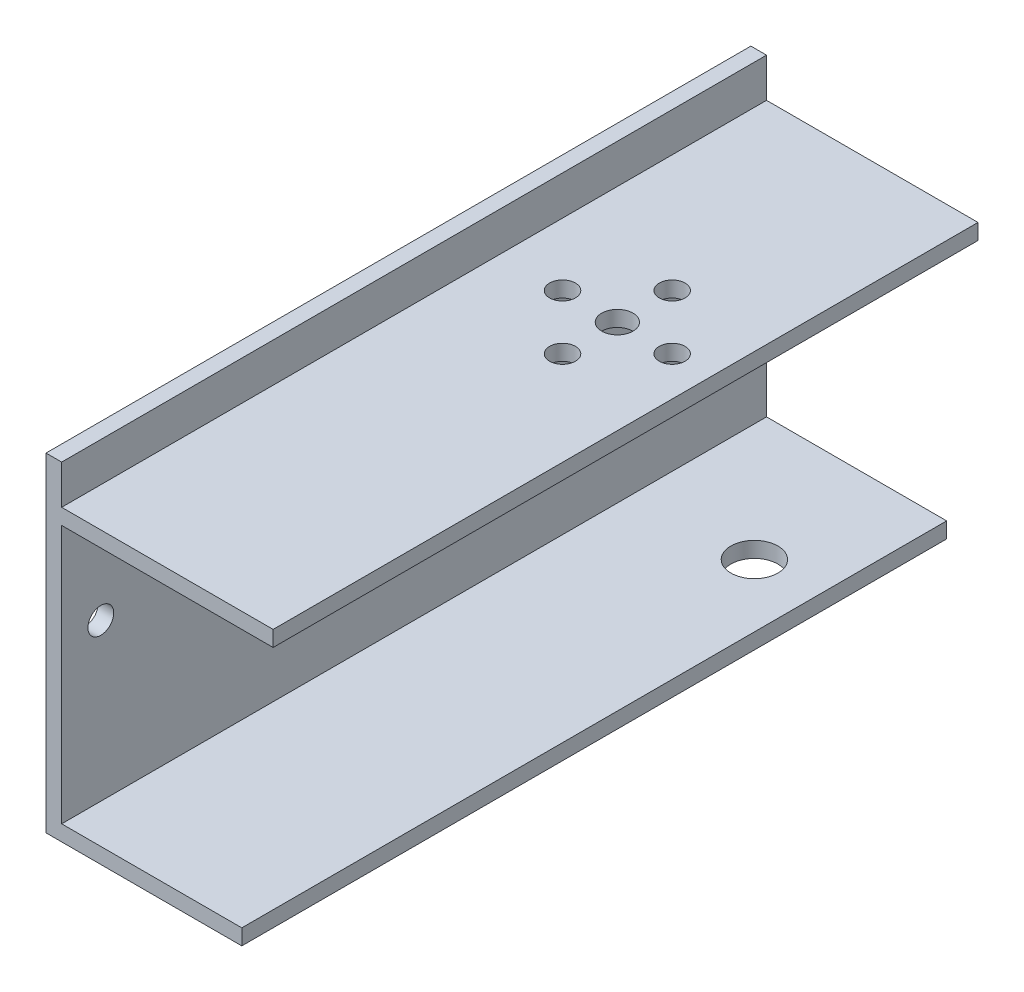
ISO-10303-21;
HEADER;
FILE_DESCRIPTION(('STEP AP214'),'2;1');
FILE_NAME('part.step','',(''),(''),'','','');
FILE_SCHEMA(('AUTOMOTIVE_DESIGN { 1 0 10303 214 1 1 1 1 }'));
ENDSEC;
DATA;
#1=APPLICATION_CONTEXT('core data for automotive mechanical design processes');
#2=APPLICATION_PROTOCOL_DEFINITION('international standard','automotive_design',2000,#1);
#3=PRODUCT_CONTEXT('',#1,'mechanical');
#4=PRODUCT('Part','Part','',(#3));
#5=PRODUCT_RELATED_PRODUCT_CATEGORY('part','',(#4));
#6=PRODUCT_DEFINITION_FORMATION('','',#4);
#7=PRODUCT_DEFINITION_CONTEXT('part definition',#1,'design');
#8=PRODUCT_DEFINITION('design','',#6,#7);
#9=PRODUCT_DEFINITION_SHAPE('','',#8);
#10=(LENGTH_UNIT() NAMED_UNIT(*) SI_UNIT(.MILLI.,.METRE.));
#11=(NAMED_UNIT(*) PLANE_ANGLE_UNIT() SI_UNIT($,.RADIAN.));
#12=(NAMED_UNIT(*) SI_UNIT($,.STERADIAN.) SOLID_ANGLE_UNIT());
#13=UNCERTAINTY_MEASURE_WITH_UNIT(LENGTH_MEASURE(1.E-05),#10,'distance_accuracy_value','');
#14=(GEOMETRIC_REPRESENTATION_CONTEXT(3) GLOBAL_UNCERTAINTY_ASSIGNED_CONTEXT((#13)) GLOBAL_UNIT_ASSIGNED_CONTEXT((#10,
#11,#12)) REPRESENTATION_CONTEXT('',''));
#15=CARTESIAN_POINT('',(0.,0.,0.));
#16=DIRECTION('',(0.,0.,1.));
#17=DIRECTION('',(1.,0.,0.));
#18=AXIS2_PLACEMENT_3D('',#15,#16,#17);
#19=CARTESIAN_POINT('',(-10.5,42.,-45.));
#20=DIRECTION('',(-1.,0.,0.));
#21=DIRECTION('',(0.,0.,1.));
#22=AXIS2_PLACEMENT_3D('',#19,#20,#21);
#23=PLANE('',#22);
#24=CARTESIAN_POINT('',(-10.5,28.,15.));
#25=DIRECTION('',(-1.,0.,0.));
#26=DIRECTION('',(0.,0.,1.));
#27=AXIS2_PLACEMENT_3D('',#24,#25,#26);
#28=CIRCLE('',#27,1.65);
#29=CARTESIAN_POINT('',(-10.5,28.,16.65));
#30=VERTEX_POINT('',#29);
#31=EDGE_CURVE('E175',#30,#30,#28,.T.);
#32=ORIENTED_EDGE('',*,*,#31,.T.);
#33=EDGE_LOOP('',(#32));
#34=FACE_BOUND('',#33,.T.);
#35=CARTESIAN_POINT('',(-10.5,14.,15.));
#36=DIRECTION('',(-1.,0.,0.));
#37=DIRECTION('',(0.,0.,1.));
#38=AXIS2_PLACEMENT_3D('',#35,#36,#37);
#39=CIRCLE('',#38,1.65);
#40=CARTESIAN_POINT('',(-10.5,14.,16.65));
#41=VERTEX_POINT('',#40);
#42=EDGE_CURVE('E229',#41,#41,#39,.T.);
#43=ORIENTED_EDGE('',*,*,#42,.T.);
#44=EDGE_LOOP('',(#43));
#45=FACE_BOUND('',#44,.T.);
#46=CARTESIAN_POINT('',(-10.5,17.3833849643897,21.5247955875199));
#47=DIRECTION('',(-1.,0.,0.));
#48=DIRECTION('',(0.,0.,1.));
#49=AXIS2_PLACEMENT_3D('',#46,#47,#48);
#50=CIRCLE('',#49,1.65);
#51=CARTESIAN_POINT('',(-10.5,17.3833849643897,23.1747955875199));
#52=VERTEX_POINT('',#51);
#53=EDGE_CURVE('E232',#52,#52,#50,.T.);
#54=ORIENTED_EDGE('',*,*,#53,.T.);
#55=EDGE_LOOP('',(#54));
#56=FACE_BOUND('',#55,.T.);
#57=CARTESIAN_POINT('',(-10.5,21.,8.00000000000001));
#58=DIRECTION('',(-1.,0.,0.));
#59=DIRECTION('',(0.,0.,1.));
#60=AXIS2_PLACEMENT_3D('',#57,#58,#59);
#61=CIRCLE('',#60,1.65);
#62=CARTESIAN_POINT('',(-10.5,21.,9.65000000000001));
#63=VERTEX_POINT('',#62);
#64=EDGE_CURVE('E196',#63,#63,#61,.T.);
#65=ORIENTED_EDGE('',*,*,#64,.T.);
#66=EDGE_LOOP('',(#65));
#67=FACE_BOUND('',#66,.T.);
#68=CARTESIAN_POINT('',(-10.5,22.,-40.));
#69=DIRECTION('',(1.,0.,0.));
#70=DIRECTION('',(0.,0.,-1.));
#71=AXIS2_PLACEMENT_3D('',#68,#69,#70);
#72=CIRCLE('',#71,1.65);
#73=CARTESIAN_POINT('',(-10.5,22.,-41.65));
#74=VERTEX_POINT('',#73);
#75=EDGE_CURVE('E148',#74,#74,#72,.T.);
#76=ORIENTED_EDGE('',*,*,#75,.F.);
#77=EDGE_LOOP('',(#76));
#78=FACE_BOUND('',#77,.T.);
#79=CARTESIAN_POINT('',(-10.5,22.,40.));
#80=DIRECTION('',(1.,0.,0.));
#81=DIRECTION('',(0.,0.,-1.));
#82=AXIS2_PLACEMENT_3D('',#79,#80,#81);
#83=CIRCLE('',#82,1.65);
#84=CARTESIAN_POINT('',(-10.5,22.,38.35));
#85=VERTEX_POINT('',#84);
#86=EDGE_CURVE('E151',#85,#85,#83,.T.);
#87=ORIENTED_EDGE('',*,*,#86,.F.);
#88=EDGE_LOOP('',(#87));
#89=FACE_BOUND('',#88,.T.);
#90=DIRECTION('',(0.,0.,-1.));
#91=VECTOR('',#90,1.);
#92=CARTESIAN_POINT('',(-10.5,35.,0.));
#93=LINE('',#92,#91);
#94=CARTESIAN_POINT('',(-10.5,35.,45.));
#95=VERTEX_POINT('',#94);
#96=CARTESIAN_POINT('',(-10.5,35.,-45.));
#97=VERTEX_POINT('',#96);
#98=EDGE_CURVE('E64',#95,#97,#93,.T.);
#99=ORIENTED_EDGE('',*,*,#98,.F.);
#100=DIRECTION('',(0.,-1.,0.));
#101=VECTOR('',#100,1.);
#102=CARTESIAN_POINT('',(-10.5,42.,45.));
#103=LINE('',#102,#101);
#104=CARTESIAN_POINT('',(-10.5,2.,45.));
#105=VERTEX_POINT('',#104);
#106=EDGE_CURVE('E147',#95,#105,#103,.T.);
#107=ORIENTED_EDGE('',*,*,#106,.T.);
#108=DIRECTION('',(0.,0.,-1.));
#109=VECTOR('',#108,1.);
#110=CARTESIAN_POINT('',(-10.5,2.,-45.));
#111=LINE('',#110,#109);
#112=CARTESIAN_POINT('',(-10.5,2.,-45.));
#113=VERTEX_POINT('',#112);
#114=EDGE_CURVE('E188',#105,#113,#111,.T.);
#115=ORIENTED_EDGE('',*,*,#114,.T.);
#116=DIRECTION('',(0.,-1.,0.));
#117=VECTOR('',#116,1.);
#118=CARTESIAN_POINT('',(-10.5,42.,-45.));
#119=LINE('',#118,#117);
#120=EDGE_CURVE('E69',#97,#113,#119,.T.);
#121=ORIENTED_EDGE('',*,*,#120,.F.);
#122=EDGE_LOOP('',(#99,#107,#115,#121));
#123=FACE_BOUND('',#122,.T.);
#124=ADVANCED_FACE('F47',(#34,#45,#56,#67,#78,#89,#123),#23,.F.);
#125=DIRECTION('',(0.,0.,1.));
#126=VECTOR('',#125,1.);
#127=CARTESIAN_POINT('',(-10.5,37.,0.));
#128=LINE('',#127,#126);
#129=CARTESIAN_POINT('',(-10.5,37.,-45.));
#130=VERTEX_POINT('',#129);
#131=CARTESIAN_POINT('',(-10.5,37.,45.));
#132=VERTEX_POINT('',#131);
#133=EDGE_CURVE('E143',#130,#132,#128,.T.);
#134=ORIENTED_EDGE('',*,*,#133,.F.);
#135=CARTESIAN_POINT('',(-10.5,42.,-45.));
#136=VERTEX_POINT('',#135);
#137=EDGE_CURVE('E197',#136,#130,#119,.T.);
#138=ORIENTED_EDGE('',*,*,#137,.F.);
#139=DIRECTION('',(0.,0.,-1.));
#140=VECTOR('',#139,1.);
#141=CARTESIAN_POINT('',(-10.5,42.,-45.));
#142=LINE('',#141,#140);
#143=CARTESIAN_POINT('',(-10.5,42.,45.));
#144=VERTEX_POINT('',#143);
#145=EDGE_CURVE('E190',#144,#136,#142,.T.);
#146=ORIENTED_EDGE('',*,*,#145,.F.);
#147=EDGE_CURVE('E200',#144,#132,#103,.T.);
#148=ORIENTED_EDGE('',*,*,#147,.T.);
#149=EDGE_LOOP('',(#134,#138,#146,#148));
#150=FACE_BOUND('',#149,.T.);
#151=ADVANCED_FACE('F270',(#150),#23,.F.);
#152=CARTESIAN_POINT('',(0.,2.,0.));
#153=DIRECTION('',(0.,-1.,0.));
#154=DIRECTION('',(0.,0.,-1.));
#155=AXIS2_PLACEMENT_3D('',#152,#153,#154);
#156=PLANE('',#155);
#157=CARTESIAN_POINT('',(4.5,2.,-28.45));
#158=DIRECTION('',(0.,-1.,0.));
#159=DIRECTION('',(0.,0.,-1.));
#160=AXIS2_PLACEMENT_3D('',#157,#158,#159);
#161=CIRCLE('',#160,3.);
#162=CARTESIAN_POINT('',(4.5,2.,-31.45));
#163=VERTEX_POINT('',#162);
#164=EDGE_CURVE('E168',#163,#163,#161,.T.);
#165=ORIENTED_EDGE('',*,*,#164,.T.);
#166=EDGE_LOOP('',(#165));
#167=FACE_BOUND('',#166,.T.);
#168=ORIENTED_EDGE('',*,*,#114,.F.);
#169=DIRECTION('',(1.,0.,0.));
#170=VECTOR('',#169,1.);
#171=CARTESIAN_POINT('',(-12.5,2.,45.));
#172=LINE('',#171,#170);
#173=CARTESIAN_POINT('',(12.5,2.,45.));
#174=VERTEX_POINT('',#173);
#175=EDGE_CURVE('E210',#105,#174,#172,.T.);
#176=ORIENTED_EDGE('',*,*,#175,.T.);
#177=DIRECTION('',(0.,0.,-1.));
#178=VECTOR('',#177,1.);
#179=CARTESIAN_POINT('',(12.5,2.,45.));
#180=LINE('',#179,#178);
#181=CARTESIAN_POINT('',(12.5,2.,-45.));
#182=VERTEX_POINT('',#181);
#183=EDGE_CURVE('E203',#174,#182,#180,.T.);
#184=ORIENTED_EDGE('',*,*,#183,.T.);
#185=DIRECTION('',(-1.,0.,0.));
#186=VECTOR('',#185,1.);
#187=CARTESIAN_POINT('',(-12.5,2.,-45.));
#188=LINE('',#187,#186);
#189=EDGE_CURVE('E206',#182,#113,#188,.T.);
#190=ORIENTED_EDGE('',*,*,#189,.T.);
#191=EDGE_LOOP('',(#168,#176,#184,#190));
#192=FACE_BOUND('',#191,.T.);
#193=ADVANCED_FACE('F289',(#167,#192),#156,.F.);
#194=CARTESIAN_POINT('',(12.5,2.,45.));
#195=DIRECTION('',(-1.,0.,0.));
#196=DIRECTION('',(0.,0.,1.));
#197=AXIS2_PLACEMENT_3D('',#194,#195,#196);
#198=PLANE('',#197);
#199=DIRECTION('',(0.,0.,-1.));
#200=VECTOR('',#199,1.);
#201=CARTESIAN_POINT('',(12.5,0.,45.));
#202=LINE('',#201,#200);
#203=CARTESIAN_POINT('',(12.5,0.,45.));
#204=VERTEX_POINT('',#203);
#205=CARTESIAN_POINT('',(12.5,0.,-45.));
#206=VERTEX_POINT('',#205);
#207=EDGE_CURVE('E202',#204,#206,#202,.T.);
#208=ORIENTED_EDGE('',*,*,#207,.T.);
#209=DIRECTION('',(0.,-1.,0.));
#210=VECTOR('',#209,1.);
#211=CARTESIAN_POINT('',(12.5,2.,-45.));
#212=LINE('',#211,#210);
#213=EDGE_CURVE('E12',#182,#206,#212,.T.);
#214=ORIENTED_EDGE('',*,*,#213,.F.);
#215=ORIENTED_EDGE('',*,*,#183,.F.);
#216=DIRECTION('',(0.,-1.,0.));
#217=VECTOR('',#216,1.);
#218=CARTESIAN_POINT('',(12.5,2.,45.));
#219=LINE('',#218,#217);
#220=EDGE_CURVE('E212',#174,#204,#219,.T.);
#221=ORIENTED_EDGE('',*,*,#220,.T.);
#222=EDGE_LOOP('',(#208,#214,#215,#221));
#223=FACE_BOUND('',#222,.T.);
#224=ADVANCED_FACE('F49',(#223),#198,.F.);
#225=CARTESIAN_POINT('',(-12.5,2.,-45.));
#226=DIRECTION('',(0.,0.,1.));
#227=DIRECTION('',(1.,0.,0.));
#228=AXIS2_PLACEMENT_3D('',#225,#226,#227);
#229=PLANE('',#228);
#230=DIRECTION('',(-1.,0.,0.));
#231=VECTOR('',#230,1.);
#232=CARTESIAN_POINT('',(-12.5,0.,-45.));
#233=LINE('',#232,#231);
#234=CARTESIAN_POINT('',(-12.5,0.,-45.));
#235=VERTEX_POINT('',#234);
#236=EDGE_CURVE('E215',#206,#235,#233,.T.);
#237=ORIENTED_EDGE('',*,*,#236,.T.);
#238=DIRECTION('',(0.,-1.,0.));
#239=VECTOR('',#238,1.);
#240=CARTESIAN_POINT('',(-12.5,2.,-45.));
#241=LINE('',#240,#239);
#242=CARTESIAN_POINT('',(-12.5,42.,-45.));
#243=VERTEX_POINT('',#242);
#244=EDGE_CURVE('E56',#243,#235,#241,.T.);
#245=ORIENTED_EDGE('',*,*,#244,.F.);
#246=DIRECTION('',(-1.,0.,0.));
#247=VECTOR('',#246,1.);
#248=CARTESIAN_POINT('',(-12.5,42.,-45.));
#249=LINE('',#248,#247);
#250=EDGE_CURVE('E192',#136,#243,#249,.T.);
#251=ORIENTED_EDGE('',*,*,#250,.F.);
#252=ORIENTED_EDGE('',*,*,#137,.T.);
#253=DIRECTION('',(-1.,0.,0.));
#254=VECTOR('',#253,1.);
#255=CARTESIAN_POINT('',(16.5,37.,-45.));
#256=LINE('',#255,#254);
#257=CARTESIAN_POINT('',(16.5,37.,-45.));
#258=VERTEX_POINT('',#257);
#259=EDGE_CURVE('E153',#258,#130,#256,.T.);
#260=ORIENTED_EDGE('',*,*,#259,.F.);
#261=DIRECTION('',(0.,1.,0.));
#262=VECTOR('',#261,1.);
#263=CARTESIAN_POINT('',(16.5,0.,-45.));
#264=LINE('',#263,#262);
#265=CARTESIAN_POINT('',(16.5,35.,-45.));
#266=VERTEX_POINT('',#265);
#267=EDGE_CURVE('E133',#266,#258,#264,.T.);
#268=ORIENTED_EDGE('',*,*,#267,.F.);
#269=DIRECTION('',(-1.,0.,0.));
#270=VECTOR('',#269,1.);
#271=CARTESIAN_POINT('',(16.5,35.,-45.));
#272=LINE('',#271,#270);
#273=EDGE_CURVE('E130',#266,#97,#272,.T.);
#274=ORIENTED_EDGE('',*,*,#273,.T.);
#275=ORIENTED_EDGE('',*,*,#120,.T.);
#276=ORIENTED_EDGE('',*,*,#189,.F.);
#277=ORIENTED_EDGE('',*,*,#213,.T.);
#278=EDGE_LOOP('',(#237,#245,#251,#252,#260,#268,#274,#275,#276,#277));
#279=FACE_BOUND('',#278,.T.);
#280=ADVANCED_FACE('F265',(#279),#229,.F.);
#281=CARTESIAN_POINT('',(-12.5,2.,45.));
#282=DIRECTION('',(1.,0.,0.));
#283=DIRECTION('',(0.,0.,-1.));
#284=AXIS2_PLACEMENT_3D('',#281,#282,#283);
#285=PLANE('',#284);
#286=CARTESIAN_POINT('',(-12.5,22.,40.));
#287=DIRECTION('',(1.,0.,0.));
#288=DIRECTION('',(0.,0.,-1.));
#289=AXIS2_PLACEMENT_3D('',#286,#287,#288);
#290=CIRCLE('',#289,1.65);
#291=CARTESIAN_POINT('',(-12.5,22.,38.35));
#292=VERTEX_POINT('',#291);
#293=EDGE_CURVE('E162',#292,#292,#290,.T.);
#294=ORIENTED_EDGE('',*,*,#293,.T.);
#295=EDGE_LOOP('',(#294));
#296=FACE_BOUND('',#295,.T.);
#297=CARTESIAN_POINT('',(-12.5,22.,-40.));
#298=DIRECTION('',(1.,0.,0.));
#299=DIRECTION('',(0.,0.,-1.));
#300=AXIS2_PLACEMENT_3D('',#297,#298,#299);
#301=CIRCLE('',#300,1.65);
#302=CARTESIAN_POINT('',(-12.5,22.,-41.65));
#303=VERTEX_POINT('',#302);
#304=EDGE_CURVE('E158',#303,#303,#301,.T.);
#305=ORIENTED_EDGE('',*,*,#304,.T.);
#306=EDGE_LOOP('',(#305));
#307=FACE_BOUND('',#306,.T.);
#308=CARTESIAN_POINT('',(-12.5,21.,8.00000000000001));
#309=DIRECTION('',(-1.,0.,0.));
#310=DIRECTION('',(0.,0.,1.));
#311=AXIS2_PLACEMENT_3D('',#308,#309,#310);
#312=CIRCLE('',#311,1.65);
#313=CARTESIAN_POINT('',(-12.5,21.,9.65000000000001));
#314=VERTEX_POINT('',#313);
#315=EDGE_CURVE('E172',#314,#314,#312,.T.);
#316=ORIENTED_EDGE('',*,*,#315,.F.);
#317=EDGE_LOOP('',(#316));
#318=FACE_BOUND('',#317,.T.);
#319=CARTESIAN_POINT('',(-12.5,17.3833849643897,21.5247955875199));
#320=DIRECTION('',(-1.,0.,0.));
#321=DIRECTION('',(0.,0.,-1.));
#322=AXIS2_PLACEMENT_3D('',#319,#320,#321);
#323=CIRCLE('',#322,1.65);
#324=CARTESIAN_POINT('',(-12.5,17.3833849643897,19.8747955875199));
#325=VERTEX_POINT('',#324);
#326=EDGE_CURVE('E176',#325,#325,#323,.T.);
#327=ORIENTED_EDGE('',*,*,#326,.F.);
#328=EDGE_LOOP('',(#327));
#329=FACE_BOUND('',#328,.T.);
#330=CARTESIAN_POINT('',(-12.5,14.,15.));
#331=DIRECTION('',(-1.,0.,0.));
#332=DIRECTION('',(0.,0.,1.));
#333=AXIS2_PLACEMENT_3D('',#330,#331,#332);
#334=CIRCLE('',#333,1.65);
#335=CARTESIAN_POINT('',(-12.5,14.,16.65));
#336=VERTEX_POINT('',#335);
#337=EDGE_CURVE('E179',#336,#336,#334,.T.);
#338=ORIENTED_EDGE('',*,*,#337,.F.);
#339=EDGE_LOOP('',(#338));
#340=FACE_BOUND('',#339,.T.);
#341=CARTESIAN_POINT('',(-12.5,28.,15.));
#342=DIRECTION('',(-1.,0.,0.));
#343=DIRECTION('',(0.,0.,-1.));
#344=AXIS2_PLACEMENT_3D('',#341,#342,#343);
#345=CIRCLE('',#344,1.65);
#346=CARTESIAN_POINT('',(-12.5,28.,13.35));
#347=VERTEX_POINT('',#346);
#348=EDGE_CURVE('E171',#347,#347,#345,.T.);
#349=ORIENTED_EDGE('',*,*,#348,.F.);
#350=EDGE_LOOP('',(#349));
#351=FACE_BOUND('',#350,.T.);
#352=DIRECTION('',(0.,0.,1.));
#353=VECTOR('',#352,1.);
#354=CARTESIAN_POINT('',(-12.5,0.,45.));
#355=LINE('',#354,#353);
#356=CARTESIAN_POINT('',(-12.5,0.,45.));
#357=VERTEX_POINT('',#356);
#358=EDGE_CURVE('E217',#235,#357,#355,.T.);
#359=ORIENTED_EDGE('',*,*,#358,.T.);
#360=DIRECTION('',(0.,-1.,0.));
#361=VECTOR('',#360,1.);
#362=CARTESIAN_POINT('',(-12.5,2.,45.));
#363=LINE('',#362,#361);
#364=CARTESIAN_POINT('',(-12.5,42.,45.));
#365=VERTEX_POINT('',#364);
#366=EDGE_CURVE('E222',#365,#357,#363,.T.);
#367=ORIENTED_EDGE('',*,*,#366,.F.);
#368=DIRECTION('',(0.,0.,1.));
#369=VECTOR('',#368,1.);
#370=CARTESIAN_POINT('',(-12.5,42.,-45.));
#371=LINE('',#370,#369);
#372=EDGE_CURVE('E184',#243,#365,#371,.T.);
#373=ORIENTED_EDGE('',*,*,#372,.F.);
#374=ORIENTED_EDGE('',*,*,#244,.T.);
#375=EDGE_LOOP('',(#359,#367,#373,#374));
#376=FACE_BOUND('',#375,.T.);
#377=ADVANCED_FACE('F278',(#296,#307,#318,#329,#340,#351,#376),#285,.F.);
#378=CARTESIAN_POINT('',(-12.5,2.,45.));
#379=DIRECTION('',(0.,0.,-1.));
#380=DIRECTION('',(-1.,0.,0.));
#381=AXIS2_PLACEMENT_3D('',#378,#379,#380);
#382=PLANE('',#381);
#383=DIRECTION('',(1.,0.,0.));
#384=VECTOR('',#383,1.);
#385=CARTESIAN_POINT('',(-12.5,0.,45.));
#386=LINE('',#385,#384);
#387=EDGE_CURVE('E207',#357,#204,#386,.T.);
#388=ORIENTED_EDGE('',*,*,#387,.T.);
#389=ORIENTED_EDGE('',*,*,#220,.F.);
#390=ORIENTED_EDGE('',*,*,#175,.F.);
#391=ORIENTED_EDGE('',*,*,#106,.F.);
#392=DIRECTION('',(-1.,0.,0.));
#393=VECTOR('',#392,1.);
#394=CARTESIAN_POINT('',(16.5,35.,45.));
#395=LINE('',#394,#393);
#396=CARTESIAN_POINT('',(16.5,35.,45.));
#397=VERTEX_POINT('',#396);
#398=EDGE_CURVE('E128',#397,#95,#395,.T.);
#399=ORIENTED_EDGE('',*,*,#398,.F.);
#400=DIRECTION('',(0.,-1.,0.));
#401=VECTOR('',#400,1.);
#402=CARTESIAN_POINT('',(16.5,0.,45.));
#403=LINE('',#402,#401);
#404=CARTESIAN_POINT('',(16.5,37.,45.));
#405=VERTEX_POINT('',#404);
#406=EDGE_CURVE('E134',#405,#397,#403,.T.);
#407=ORIENTED_EDGE('',*,*,#406,.F.);
#408=DIRECTION('',(-1.,0.,0.));
#409=VECTOR('',#408,1.);
#410=CARTESIAN_POINT('',(16.5,37.,45.));
#411=LINE('',#410,#409);
#412=EDGE_CURVE('E259',#405,#132,#411,.T.);
#413=ORIENTED_EDGE('',*,*,#412,.T.);
#414=ORIENTED_EDGE('',*,*,#147,.F.);
#415=DIRECTION('',(1.,0.,0.));
#416=VECTOR('',#415,1.);
#417=CARTESIAN_POINT('',(-12.5,42.,45.));
#418=LINE('',#417,#416);
#419=EDGE_CURVE('E187',#365,#144,#418,.T.);
#420=ORIENTED_EDGE('',*,*,#419,.F.);
#421=ORIENTED_EDGE('',*,*,#366,.T.);
#422=EDGE_LOOP('',(#388,#389,#390,#391,#399,#407,#413,#414,#420,#421));
#423=FACE_BOUND('',#422,.T.);
#424=ADVANCED_FACE('F145',(#423),#382,.F.);
#425=CARTESIAN_POINT('',(0.,0.,0.));
#426=DIRECTION('',(0.,-1.,0.));
#427=DIRECTION('',(0.,0.,-1.));
#428=AXIS2_PLACEMENT_3D('',#425,#426,#427);
#429=PLANE('',#428);
#430=CARTESIAN_POINT('',(4.5,0.,-28.45));
#431=DIRECTION('',(0.,-1.,0.));
#432=DIRECTION('',(0.,0.,-1.));
#433=AXIS2_PLACEMENT_3D('',#430,#431,#432);
#434=CIRCLE('',#433,3.);
#435=CARTESIAN_POINT('',(4.5,0.,-31.45));
#436=VERTEX_POINT('',#435);
#437=EDGE_CURVE('E165',#436,#436,#434,.T.);
#438=ORIENTED_EDGE('',*,*,#437,.F.);
#439=EDGE_LOOP('',(#438));
#440=FACE_BOUND('',#439,.T.);
#441=ORIENTED_EDGE('',*,*,#207,.F.);
#442=ORIENTED_EDGE('',*,*,#387,.F.);
#443=ORIENTED_EDGE('',*,*,#358,.F.);
#444=ORIENTED_EDGE('',*,*,#236,.F.);
#445=EDGE_LOOP('',(#441,#442,#443,#444));
#446=FACE_BOUND('',#445,.T.);
#447=ADVANCED_FACE('F282',(#440,#446),#429,.T.);
#448=CARTESIAN_POINT('',(0.,42.,0.));
#449=DIRECTION('',(0.,1.,0.));
#450=DIRECTION('',(0.,0.,1.));
#451=AXIS2_PLACEMENT_3D('',#448,#449,#450);
#452=PLANE('',#451);
#453=ORIENTED_EDGE('',*,*,#372,.T.);
#454=ORIENTED_EDGE('',*,*,#419,.T.);
#455=ORIENTED_EDGE('',*,*,#145,.T.);
#456=ORIENTED_EDGE('',*,*,#250,.T.);
#457=EDGE_LOOP('',(#453,#454,#455,#456));
#458=FACE_BOUND('',#457,.T.);
#459=ADVANCED_FACE('F276',(#458),#452,.T.);
#460=CARTESIAN_POINT('',(-2.5,28.,15.));
#461=DIRECTION('',(-1.,0.,0.));
#462=DIRECTION('',(0.,0.,1.));
#463=AXIS2_PLACEMENT_3D('',#460,#461,#462);
#464=CYLINDRICAL_SURFACE('',#463,1.65);
#465=ORIENTED_EDGE('',*,*,#348,.T.);
#466=EDGE_LOOP('',(#465));
#467=FACE_BOUND('',#466,.T.);
#468=ORIENTED_EDGE('',*,*,#31,.F.);
#469=EDGE_LOOP('',(#468));
#470=FACE_BOUND('',#469,.T.);
#471=ADVANCED_FACE('F449',(#467,#470),#464,.F.);
#472=CARTESIAN_POINT('',(-2.5,14.,15.));
#473=DIRECTION('',(-1.,0.,0.));
#474=DIRECTION('',(0.,0.,1.));
#475=AXIS2_PLACEMENT_3D('',#472,#473,#474);
#476=CYLINDRICAL_SURFACE('',#475,1.65);
#477=ORIENTED_EDGE('',*,*,#337,.T.);
#478=EDGE_LOOP('',(#477));
#479=FACE_BOUND('',#478,.T.);
#480=ORIENTED_EDGE('',*,*,#42,.F.);
#481=EDGE_LOOP('',(#480));
#482=FACE_BOUND('',#481,.T.);
#483=ADVANCED_FACE('F446',(#479,#482),#476,.F.);
#484=CARTESIAN_POINT('',(-2.5,17.3833849643897,21.5247955875199));
#485=DIRECTION('',(-1.,0.,0.));
#486=DIRECTION('',(0.,0.,1.));
#487=AXIS2_PLACEMENT_3D('',#484,#485,#486);
#488=CYLINDRICAL_SURFACE('',#487,1.65);
#489=ORIENTED_EDGE('',*,*,#326,.T.);
#490=EDGE_LOOP('',(#489));
#491=FACE_BOUND('',#490,.T.);
#492=ORIENTED_EDGE('',*,*,#53,.F.);
#493=EDGE_LOOP('',(#492));
#494=FACE_BOUND('',#493,.T.);
#495=ADVANCED_FACE('F442',(#491,#494),#488,.F.);
#496=CARTESIAN_POINT('',(-2.5,21.,8.00000000000001));
#497=DIRECTION('',(-1.,0.,0.));
#498=DIRECTION('',(0.,0.,1.));
#499=AXIS2_PLACEMENT_3D('',#496,#497,#498);
#500=CYLINDRICAL_SURFACE('',#499,1.65);
#501=ORIENTED_EDGE('',*,*,#315,.T.);
#502=EDGE_LOOP('',(#501));
#503=FACE_BOUND('',#502,.T.);
#504=ORIENTED_EDGE('',*,*,#64,.F.);
#505=EDGE_LOOP('',(#504));
#506=FACE_BOUND('',#505,.T.);
#507=ADVANCED_FACE('F438',(#503,#506),#500,.F.);
#508=CARTESIAN_POINT('',(4.5,10.,-28.45));
#509=DIRECTION('',(0.,-1.,0.));
#510=DIRECTION('',(0.,0.,-1.));
#511=AXIS2_PLACEMENT_3D('',#508,#509,#510);
#512=CYLINDRICAL_SURFACE('',#511,3.);
#513=ORIENTED_EDGE('',*,*,#437,.T.);
#514=EDGE_LOOP('',(#513));
#515=FACE_BOUND('',#514,.T.);
#516=ORIENTED_EDGE('',*,*,#164,.F.);
#517=EDGE_LOOP('',(#516));
#518=FACE_BOUND('',#517,.T.);
#519=ADVANCED_FACE('F434',(#515,#518),#512,.F.);
#520=CARTESIAN_POINT('',(-20.5,22.,-40.));
#521=DIRECTION('',(1.,0.,0.));
#522=DIRECTION('',(0.,0.,-1.));
#523=AXIS2_PLACEMENT_3D('',#520,#521,#522);
#524=CYLINDRICAL_SURFACE('',#523,1.65);
#525=ORIENTED_EDGE('',*,*,#75,.T.);
#526=EDGE_LOOP('',(#525));
#527=FACE_BOUND('',#526,.T.);
#528=ORIENTED_EDGE('',*,*,#304,.F.);
#529=EDGE_LOOP('',(#528));
#530=FACE_BOUND('',#529,.T.);
#531=ADVANCED_FACE('F430',(#527,#530),#524,.F.);
#532=CARTESIAN_POINT('',(-20.5,22.,40.));
#533=DIRECTION('',(1.,0.,0.));
#534=DIRECTION('',(0.,0.,-1.));
#535=AXIS2_PLACEMENT_3D('',#532,#533,#534);
#536=CYLINDRICAL_SURFACE('',#535,1.65);
#537=ORIENTED_EDGE('',*,*,#86,.T.);
#538=EDGE_LOOP('',(#537));
#539=FACE_BOUND('',#538,.T.);
#540=ORIENTED_EDGE('',*,*,#293,.F.);
#541=EDGE_LOOP('',(#540));
#542=FACE_BOUND('',#541,.T.);
#543=ADVANCED_FACE('F366',(#539,#542),#536,.F.);
#544=CARTESIAN_POINT('',(16.5,35.,0.));
#545=DIRECTION('',(0.,1.,0.));
#546=DIRECTION('',(0.,0.,1.));
#547=AXIS2_PLACEMENT_3D('',#544,#545,#546);
#548=PLANE('',#547);
#549=CARTESIAN_POINT('',(4.50000000000007,35.,-3.95));
#550=DIRECTION('',(0.,-1.,0.));
#551=DIRECTION('',(0.,0.,-1.));
#552=AXIS2_PLACEMENT_3D('',#549,#550,#551);
#553=CIRCLE('',#552,1.65);
#554=CARTESIAN_POINT('',(4.50000000000007,35.,-5.6));
#555=VERTEX_POINT('',#554);
#556=EDGE_CURVE('E241',#555,#555,#553,.T.);
#557=ORIENTED_EDGE('',*,*,#556,.F.);
#558=EDGE_LOOP('',(#557));
#559=FACE_BOUND('',#558,.T.);
#560=CARTESIAN_POINT('',(4.49999999999998,35.,-17.95));
#561=DIRECTION('',(0.,-1.,0.));
#562=DIRECTION('',(0.,0.,-1.));
#563=AXIS2_PLACEMENT_3D('',#560,#561,#562);
#564=CIRCLE('',#563,1.65);
#565=CARTESIAN_POINT('',(4.49999999999998,35.,-19.6));
#566=VERTEX_POINT('',#565);
#567=EDGE_CURVE('E574',#566,#566,#564,.T.);
#568=ORIENTED_EDGE('',*,*,#567,.F.);
#569=EDGE_LOOP('',(#568));
#570=FACE_BOUND('',#569,.T.);
#571=CARTESIAN_POINT('',(4.5,35.,-10.95));
#572=DIRECTION('',(0.,-1.,0.));
#573=DIRECTION('',(0.,0.,-1.));
#574=AXIS2_PLACEMENT_3D('',#571,#572,#573);
#575=CIRCLE('',#574,2.);
#576=CARTESIAN_POINT('',(4.5,35.,-12.95));
#577=VERTEX_POINT('',#576);
#578=EDGE_CURVE('E571',#577,#577,#575,.T.);
#579=ORIENTED_EDGE('',*,*,#578,.F.);
#580=EDGE_LOOP('',(#579));
#581=FACE_BOUND('',#580,.T.);
#582=CARTESIAN_POINT('',(11.5,35.,-10.95));
#583=DIRECTION('',(0.,-1.,0.));
#584=DIRECTION('',(0.,0.,-1.));
#585=AXIS2_PLACEMENT_3D('',#582,#583,#584);
#586=CIRCLE('',#585,1.65);
#587=CARTESIAN_POINT('',(11.5,35.,-12.6));
#588=VERTEX_POINT('',#587);
#589=EDGE_CURVE('E568',#588,#588,#586,.T.);
#590=ORIENTED_EDGE('',*,*,#589,.F.);
#591=EDGE_LOOP('',(#590));
#592=FACE_BOUND('',#591,.T.);
#593=CARTESIAN_POINT('',(-2.5,35.,-10.9499999999999));
#594=DIRECTION('',(0.,-1.,0.));
#595=DIRECTION('',(0.,0.,-1.));
#596=AXIS2_PLACEMENT_3D('',#593,#594,#595);
#597=CIRCLE('',#596,1.65);
#598=CARTESIAN_POINT('',(-2.5,35.,-12.5999999999999));
#599=VERTEX_POINT('',#598);
#600=EDGE_CURVE('E565',#599,#599,#597,.T.);
#601=ORIENTED_EDGE('',*,*,#600,.F.);
#602=EDGE_LOOP('',(#601));
#603=FACE_BOUND('',#602,.T.);
#604=ORIENTED_EDGE('',*,*,#98,.T.);
#605=ORIENTED_EDGE('',*,*,#273,.F.);
#606=DIRECTION('',(0.,0.,-1.));
#607=VECTOR('',#606,1.);
#608=CARTESIAN_POINT('',(16.5,35.,0.));
#609=LINE('',#608,#607);
#610=EDGE_CURVE('E124',#397,#266,#609,.T.);
#611=ORIENTED_EDGE('',*,*,#610,.F.);
#612=ORIENTED_EDGE('',*,*,#398,.T.);
#613=EDGE_LOOP('',(#604,#605,#611,#612));
#614=FACE_BOUND('',#613,.T.);
#615=ADVANCED_FACE('F126',(#559,#570,#581,#592,#603,#614),#548,.F.);
#616=CARTESIAN_POINT('',(16.5,37.,0.));
#617=DIRECTION('',(0.,-1.,0.));
#618=DIRECTION('',(0.,0.,-1.));
#619=AXIS2_PLACEMENT_3D('',#616,#617,#618);
#620=PLANE('',#619);
#621=CARTESIAN_POINT('',(4.50000000000007,37.,-3.95));
#622=DIRECTION('',(0.,-1.,0.));
#623=DIRECTION('',(0.,0.,-1.));
#624=AXIS2_PLACEMENT_3D('',#621,#622,#623);
#625=CIRCLE('',#624,1.65);
#626=CARTESIAN_POINT('',(4.50000000000007,37.,-5.6));
#627=VERTEX_POINT('',#626);
#628=EDGE_CURVE('E51',#627,#627,#625,.T.);
#629=ORIENTED_EDGE('',*,*,#628,.T.);
#630=EDGE_LOOP('',(#629));
#631=FACE_BOUND('',#630,.T.);
#632=CARTESIAN_POINT('',(4.49999999999998,37.,-17.95));
#633=DIRECTION('',(0.,-1.,0.));
#634=DIRECTION('',(0.,0.,-1.));
#635=AXIS2_PLACEMENT_3D('',#632,#633,#634);
#636=CIRCLE('',#635,1.65);
#637=CARTESIAN_POINT('',(4.49999999999998,37.,-19.6));
#638=VERTEX_POINT('',#637);
#639=EDGE_CURVE('E246',#638,#638,#636,.T.);
#640=ORIENTED_EDGE('',*,*,#639,.T.);
#641=EDGE_LOOP('',(#640));
#642=FACE_BOUND('',#641,.T.);
#643=CARTESIAN_POINT('',(4.5,37.,-10.95));
#644=DIRECTION('',(0.,-1.,0.));
#645=DIRECTION('',(0.,0.,-1.));
#646=AXIS2_PLACEMENT_3D('',#643,#644,#645);
#647=CIRCLE('',#646,2.);
#648=CARTESIAN_POINT('',(4.5,37.,-12.95));
#649=VERTEX_POINT('',#648);
#650=EDGE_CURVE('E244',#649,#649,#647,.T.);
#651=ORIENTED_EDGE('',*,*,#650,.T.);
#652=EDGE_LOOP('',(#651));
#653=FACE_BOUND('',#652,.T.);
#654=CARTESIAN_POINT('',(11.5,37.,-10.95));
#655=DIRECTION('',(0.,-1.,0.));
#656=DIRECTION('',(0.,0.,-1.));
#657=AXIS2_PLACEMENT_3D('',#654,#655,#656);
#658=CIRCLE('',#657,1.65);
#659=CARTESIAN_POINT('',(11.5,37.,-12.6));
#660=VERTEX_POINT('',#659);
#661=EDGE_CURVE('E240',#660,#660,#658,.T.);
#662=ORIENTED_EDGE('',*,*,#661,.T.);
#663=EDGE_LOOP('',(#662));
#664=FACE_BOUND('',#663,.T.);
#665=CARTESIAN_POINT('',(-2.5,37.,-10.9499999999999));
#666=DIRECTION('',(0.,-1.,0.));
#667=DIRECTION('',(0.,0.,-1.));
#668=AXIS2_PLACEMENT_3D('',#665,#666,#667);
#669=CIRCLE('',#668,1.65);
#670=CARTESIAN_POINT('',(-2.5,37.,-12.5999999999999));
#671=VERTEX_POINT('',#670);
#672=EDGE_CURVE('E237',#671,#671,#669,.T.);
#673=ORIENTED_EDGE('',*,*,#672,.T.);
#674=EDGE_LOOP('',(#673));
#675=FACE_BOUND('',#674,.T.);
#676=ORIENTED_EDGE('',*,*,#133,.T.);
#677=ORIENTED_EDGE('',*,*,#412,.F.);
#678=DIRECTION('',(0.,0.,1.));
#679=VECTOR('',#678,1.);
#680=CARTESIAN_POINT('',(16.5,37.,0.));
#681=LINE('',#680,#679);
#682=EDGE_CURVE('E139',#258,#405,#681,.T.);
#683=ORIENTED_EDGE('',*,*,#682,.F.);
#684=ORIENTED_EDGE('',*,*,#259,.T.);
#685=EDGE_LOOP('',(#676,#677,#683,#684));
#686=FACE_BOUND('',#685,.T.);
#687=ADVANCED_FACE('F263',(#631,#642,#653,#664,#675,#686),#620,.F.);
#688=CARTESIAN_POINT('',(16.5,0.,0.));
#689=DIRECTION('',(1.,0.,0.));
#690=DIRECTION('',(0.,0.,-1.));
#691=AXIS2_PLACEMENT_3D('',#688,#689,#690);
#692=PLANE('',#691);
#693=ORIENTED_EDGE('',*,*,#406,.T.);
#694=ORIENTED_EDGE('',*,*,#610,.T.);
#695=ORIENTED_EDGE('',*,*,#267,.T.);
#696=ORIENTED_EDGE('',*,*,#682,.T.);
#697=EDGE_LOOP('',(#693,#694,#695,#696));
#698=FACE_BOUND('',#697,.T.);
#699=ADVANCED_FACE('F137',(#698),#692,.T.);
#700=CARTESIAN_POINT('',(-2.5,41.,-10.9499999999999));
#701=DIRECTION('',(0.,-1.,0.));
#702=DIRECTION('',(0.,0.,-1.));
#703=AXIS2_PLACEMENT_3D('',#700,#701,#702);
#704=CYLINDRICAL_SURFACE('',#703,1.65);
#705=ORIENTED_EDGE('',*,*,#600,.T.);
#706=EDGE_LOOP('',(#705));
#707=FACE_BOUND('',#706,.T.);
#708=ORIENTED_EDGE('',*,*,#672,.F.);
#709=EDGE_LOOP('',(#708));
#710=FACE_BOUND('',#709,.T.);
#711=ADVANCED_FACE('F353',(#707,#710),#704,.F.);
#712=CARTESIAN_POINT('',(11.5,41.,-10.95));
#713=DIRECTION('',(0.,-1.,0.));
#714=DIRECTION('',(0.,0.,-1.));
#715=AXIS2_PLACEMENT_3D('',#712,#713,#714);
#716=CYLINDRICAL_SURFACE('',#715,1.65);
#717=ORIENTED_EDGE('',*,*,#589,.T.);
#718=EDGE_LOOP('',(#717));
#719=FACE_BOUND('',#718,.T.);
#720=ORIENTED_EDGE('',*,*,#661,.F.);
#721=EDGE_LOOP('',(#720));
#722=FACE_BOUND('',#721,.T.);
#723=ADVANCED_FACE('F381',(#719,#722),#716,.F.);
#724=CARTESIAN_POINT('',(4.5,41.,-10.95));
#725=DIRECTION('',(0.,-1.,0.));
#726=DIRECTION('',(0.,0.,-1.));
#727=AXIS2_PLACEMENT_3D('',#724,#725,#726);
#728=CYLINDRICAL_SURFACE('',#727,2.);
#729=ORIENTED_EDGE('',*,*,#578,.T.);
#730=EDGE_LOOP('',(#729));
#731=FACE_BOUND('',#730,.T.);
#732=ORIENTED_EDGE('',*,*,#650,.F.);
#733=EDGE_LOOP('',(#732));
#734=FACE_BOUND('',#733,.T.);
#735=ADVANCED_FACE('F391',(#731,#734),#728,.F.);
#736=CARTESIAN_POINT('',(4.49999999999998,41.,-17.95));
#737=DIRECTION('',(0.,-1.,0.));
#738=DIRECTION('',(0.,0.,-1.));
#739=AXIS2_PLACEMENT_3D('',#736,#737,#738);
#740=CYLINDRICAL_SURFACE('',#739,1.65);
#741=ORIENTED_EDGE('',*,*,#567,.T.);
#742=EDGE_LOOP('',(#741));
#743=FACE_BOUND('',#742,.T.);
#744=ORIENTED_EDGE('',*,*,#639,.F.);
#745=EDGE_LOOP('',(#744));
#746=FACE_BOUND('',#745,.T.);
#747=ADVANCED_FACE('F401',(#743,#746),#740,.F.);
#748=CARTESIAN_POINT('',(4.50000000000007,41.,-3.95));
#749=DIRECTION('',(0.,-1.,0.));
#750=DIRECTION('',(0.,0.,-1.));
#751=AXIS2_PLACEMENT_3D('',#748,#749,#750);
#752=CYLINDRICAL_SURFACE('',#751,1.65);
#753=ORIENTED_EDGE('',*,*,#556,.T.);
#754=EDGE_LOOP('',(#753));
#755=FACE_BOUND('',#754,.T.);
#756=ORIENTED_EDGE('',*,*,#628,.F.);
#757=EDGE_LOOP('',(#756));
#758=FACE_BOUND('',#757,.T.);
#759=ADVANCED_FACE('F412',(#755,#758),#752,.F.);
#760=CLOSED_SHELL('',(#124,#151,#193,#224,#280,#377,#424,#447,#459,#471,#483,#495,#507,#519,
#531,#543,#615,#687,#699,#711,#723,#735,#747,#759));
#761=MANIFOLD_SOLID_BREP('B2',#760);
#762=ADVANCED_BREP_SHAPE_REPRESENTATION('',(#18,#761),#14);
#763=SHAPE_DEFINITION_REPRESENTATION(#9,#762);
ENDSEC;
END-ISO-10303-21;
